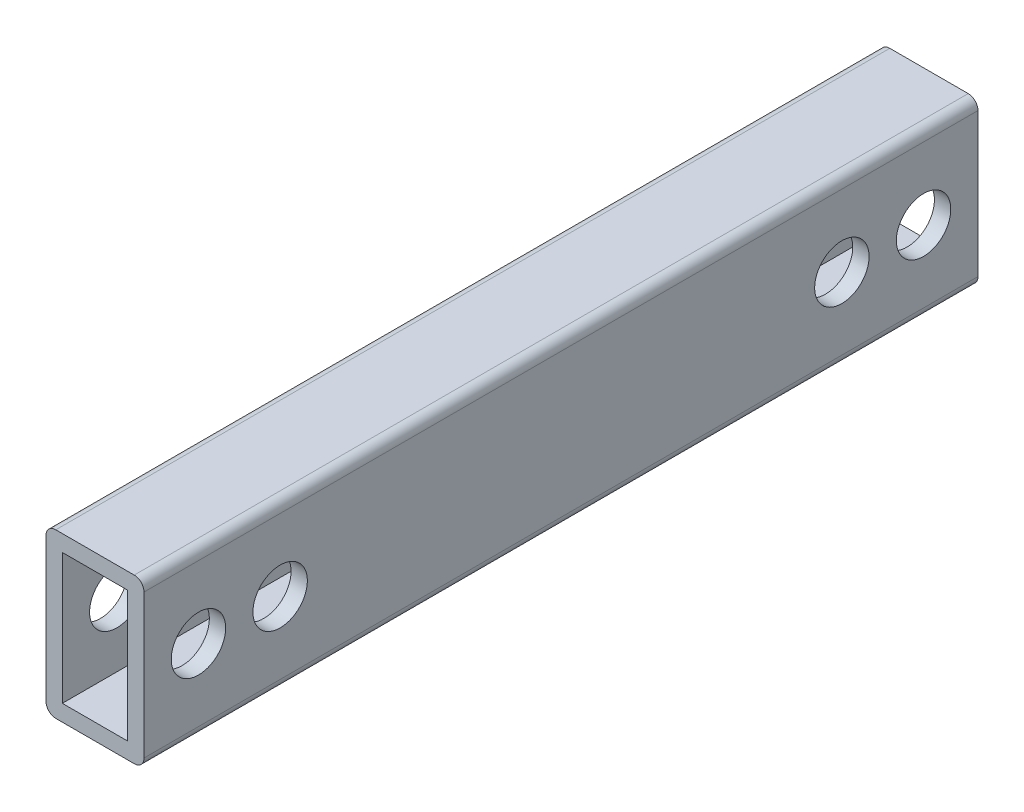
ISO-10303-21;
HEADER;
FILE_DESCRIPTION(('STEP AP214'),'2;1');
FILE_NAME('part.step','',(''),(''),'','','');
FILE_SCHEMA(('AUTOMOTIVE_DESIGN { 1 0 10303 214 1 1 1 1 }'));
ENDSEC;
DATA;
#1=APPLICATION_CONTEXT('core data for automotive mechanical design processes');
#2=APPLICATION_PROTOCOL_DEFINITION('international standard','automotive_design',2000,#1);
#3=PRODUCT_CONTEXT('',#1,'mechanical');
#4=PRODUCT('Part','Part','',(#3));
#5=PRODUCT_RELATED_PRODUCT_CATEGORY('part','',(#4));
#6=PRODUCT_DEFINITION_FORMATION('','',#4);
#7=PRODUCT_DEFINITION_CONTEXT('part definition',#1,'design');
#8=PRODUCT_DEFINITION('design','',#6,#7);
#9=PRODUCT_DEFINITION_SHAPE('','',#8);
#10=(LENGTH_UNIT() NAMED_UNIT(*) SI_UNIT(.MILLI.,.METRE.));
#11=(NAMED_UNIT(*) PLANE_ANGLE_UNIT() SI_UNIT($,.RADIAN.));
#12=(NAMED_UNIT(*) SI_UNIT($,.STERADIAN.) SOLID_ANGLE_UNIT());
#13=UNCERTAINTY_MEASURE_WITH_UNIT(LENGTH_MEASURE(1.E-05),#10,'distance_accuracy_value','');
#14=(GEOMETRIC_REPRESENTATION_CONTEXT(3) GLOBAL_UNCERTAINTY_ASSIGNED_CONTEXT((#13)) GLOBAL_UNIT_ASSIGNED_CONTEXT((#10,
#11,#12)) REPRESENTATION_CONTEXT('',''));
#15=CARTESIAN_POINT('',(0.,0.,0.));
#16=DIRECTION('',(0.,0.,1.));
#17=DIRECTION('',(1.,0.,0.));
#18=AXIS2_PLACEMENT_3D('',#15,#16,#17);
#19=CARTESIAN_POINT('',(0.,0.,153.15701543));
#20=DIRECTION('',(0.,0.,1.));
#21=DIRECTION('',(1.,0.,0.));
#22=AXIS2_PLACEMENT_3D('',#19,#20,#21);
#23=PLANE('',#22);
#24=DIRECTION('',(0.,-1.,0.));
#25=VECTOR('',#24,1.);
#26=CARTESIAN_POINT('',(-9.,-15.,153.15701543));
#27=LINE('',#26,#25);
#28=CARTESIAN_POINT('',(-9.,13.2,153.15701543));
#29=VERTEX_POINT('',#28);
#30=CARTESIAN_POINT('',(-9.,-13.2,153.15701543));
#31=VERTEX_POINT('',#30);
#32=EDGE_CURVE('E170',#29,#31,#27,.T.);
#33=ORIENTED_EDGE('',*,*,#32,.T.);
#34=CARTESIAN_POINT('',(-7.2,-13.2,153.15701543));
#35=DIRECTION('',(0.,0.,1.));
#36=DIRECTION('',(1.,0.,0.));
#37=AXIS2_PLACEMENT_3D('',#34,#35,#36);
#38=CIRCLE('',#37,1.8);
#39=CARTESIAN_POINT('',(-7.2,-15.,153.15701543));
#40=VERTEX_POINT('',#39);
#41=EDGE_CURVE('E229',#31,#40,#38,.T.);
#42=ORIENTED_EDGE('',*,*,#41,.T.);
#43=DIRECTION('',(1.,0.,0.));
#44=VECTOR('',#43,1.);
#45=CARTESIAN_POINT('',(9.,-15.,153.15701543));
#46=LINE('',#45,#44);
#47=CARTESIAN_POINT('',(7.2,-15.,153.15701543));
#48=VERTEX_POINT('',#47);
#49=EDGE_CURVE('E173',#40,#48,#46,.T.);
#50=ORIENTED_EDGE('',*,*,#49,.T.);
#51=CARTESIAN_POINT('',(7.2,-13.2,153.15701543));
#52=DIRECTION('',(0.,0.,1.));
#53=DIRECTION('',(1.,0.,0.));
#54=AXIS2_PLACEMENT_3D('',#51,#52,#53);
#55=CIRCLE('',#54,1.8);
#56=CARTESIAN_POINT('',(9.,-13.2,153.15701543));
#57=VERTEX_POINT('',#56);
#58=EDGE_CURVE('E227',#48,#57,#55,.T.);
#59=ORIENTED_EDGE('',*,*,#58,.T.);
#60=DIRECTION('',(0.,1.,0.));
#61=VECTOR('',#60,1.);
#62=CARTESIAN_POINT('',(9.,-15.,153.15701543));
#63=LINE('',#62,#61);
#64=CARTESIAN_POINT('',(9.,13.2,153.15701543));
#65=VERTEX_POINT('',#64);
#66=EDGE_CURVE('E177',#57,#65,#63,.T.);
#67=ORIENTED_EDGE('',*,*,#66,.T.);
#68=CARTESIAN_POINT('',(7.2,13.2,153.15701543));
#69=DIRECTION('',(0.,0.,1.));
#70=DIRECTION('',(1.,0.,0.));
#71=AXIS2_PLACEMENT_3D('',#68,#69,#70);
#72=CIRCLE('',#71,1.8);
#73=CARTESIAN_POINT('',(7.2,15.,153.15701543));
#74=VERTEX_POINT('',#73);
#75=EDGE_CURVE('E57',#65,#74,#72,.T.);
#76=ORIENTED_EDGE('',*,*,#75,.T.);
#77=DIRECTION('',(-1.,0.,0.));
#78=VECTOR('',#77,1.);
#79=CARTESIAN_POINT('',(9.,15.,153.15701543));
#80=LINE('',#79,#78);
#81=CARTESIAN_POINT('',(-7.2,15.,153.15701543));
#82=VERTEX_POINT('',#81);
#83=EDGE_CURVE('E179',#74,#82,#80,.T.);
#84=ORIENTED_EDGE('',*,*,#83,.T.);
#85=CARTESIAN_POINT('',(-7.2,13.2,153.15701543));
#86=DIRECTION('',(0.,0.,1.));
#87=DIRECTION('',(1.,0.,0.));
#88=AXIS2_PLACEMENT_3D('',#85,#86,#87);
#89=CIRCLE('',#88,1.8);
#90=EDGE_CURVE('E224',#82,#29,#89,.T.);
#91=ORIENTED_EDGE('',*,*,#90,.T.);
#92=EDGE_LOOP('',(#33,#42,#50,#59,#67,#76,#84,#91));
#93=FACE_BOUND('',#92,.T.);
#94=DIRECTION('',(1.,0.,0.));
#95=VECTOR('',#94,1.);
#96=CARTESIAN_POINT('',(6.,-12.,153.15701543));
#97=LINE('',#96,#95);
#98=CARTESIAN_POINT('',(-6.,-12.,153.15701543));
#99=VERTEX_POINT('',#98);
#100=CARTESIAN_POINT('',(6.,-12.,153.15701543));
#101=VERTEX_POINT('',#100);
#102=EDGE_CURVE('E137',#99,#101,#97,.T.);
#103=ORIENTED_EDGE('',*,*,#102,.F.);
#104=DIRECTION('',(0.,-1.,0.));
#105=VECTOR('',#104,1.);
#106=CARTESIAN_POINT('',(-6.,-12.,153.15701543));
#107=LINE('',#106,#105);
#108=CARTESIAN_POINT('',(-6.,12.,153.15701543));
#109=VERTEX_POINT('',#108);
#110=EDGE_CURVE('E127',#109,#99,#107,.T.);
#111=ORIENTED_EDGE('',*,*,#110,.F.);
#112=DIRECTION('',(-1.,0.,0.));
#113=VECTOR('',#112,1.);
#114=CARTESIAN_POINT('',(6.,12.,153.15701543));
#115=LINE('',#114,#113);
#116=CARTESIAN_POINT('',(6.,12.,153.15701543));
#117=VERTEX_POINT('',#116);
#118=EDGE_CURVE('E152',#117,#109,#115,.T.);
#119=ORIENTED_EDGE('',*,*,#118,.F.);
#120=DIRECTION('',(0.,1.,0.));
#121=VECTOR('',#120,1.);
#122=CARTESIAN_POINT('',(6.,-12.,153.15701543));
#123=LINE('',#122,#121);
#124=EDGE_CURVE('E150',#101,#117,#123,.T.);
#125=ORIENTED_EDGE('',*,*,#124,.F.);
#126=EDGE_LOOP('',(#103,#111,#119,#125));
#127=FACE_BOUND('',#126,.T.);
#128=ADVANCED_FACE('F36',(#93,#127),#23,.T.);
#129=CARTESIAN_POINT('',(0.,0.,0.));
#130=DIRECTION('',(0.,0.,1.));
#131=DIRECTION('',(1.,0.,0.));
#132=AXIS2_PLACEMENT_3D('',#129,#130,#131);
#133=PLANE('',#132);
#134=DIRECTION('',(1.,0.,0.));
#135=VECTOR('',#134,1.);
#136=CARTESIAN_POINT('',(9.,-15.,0.));
#137=LINE('',#136,#135);
#138=CARTESIAN_POINT('',(-7.2,-15.,0.));
#139=VERTEX_POINT('',#138);
#140=CARTESIAN_POINT('',(7.2,-15.,0.));
#141=VERTEX_POINT('',#140);
#142=EDGE_CURVE('E184',#139,#141,#137,.T.);
#143=ORIENTED_EDGE('',*,*,#142,.F.);
#144=CARTESIAN_POINT('',(-7.2,-13.2,0.));
#145=DIRECTION('',(0.,0.,1.));
#146=DIRECTION('',(1.,0.,0.));
#147=AXIS2_PLACEMENT_3D('',#144,#145,#146);
#148=CIRCLE('',#147,1.8);
#149=CARTESIAN_POINT('',(-9.,-13.2,0.));
#150=VERTEX_POINT('',#149);
#151=EDGE_CURVE('E217',#139,#150,#148,.F.);
#152=ORIENTED_EDGE('',*,*,#151,.T.);
#153=DIRECTION('',(0.,-1.,0.));
#154=VECTOR('',#153,1.);
#155=CARTESIAN_POINT('',(-9.,-15.,0.));
#156=LINE('',#155,#154);
#157=CARTESIAN_POINT('',(-9.,13.2,0.));
#158=VERTEX_POINT('',#157);
#159=EDGE_CURVE('E145',#158,#150,#156,.T.);
#160=ORIENTED_EDGE('',*,*,#159,.F.);
#161=CARTESIAN_POINT('',(-7.2,13.2,0.));
#162=DIRECTION('',(0.,0.,1.));
#163=DIRECTION('',(1.,0.,0.));
#164=AXIS2_PLACEMENT_3D('',#161,#162,#163);
#165=CIRCLE('',#164,1.8);
#166=CARTESIAN_POINT('',(-7.2,15.,0.));
#167=VERTEX_POINT('',#166);
#168=EDGE_CURVE('E211',#158,#167,#165,.F.);
#169=ORIENTED_EDGE('',*,*,#168,.T.);
#170=DIRECTION('',(-1.,0.,0.));
#171=VECTOR('',#170,1.);
#172=CARTESIAN_POINT('',(9.,15.,0.));
#173=LINE('',#172,#171);
#174=CARTESIAN_POINT('',(7.2,15.,0.));
#175=VERTEX_POINT('',#174);
#176=EDGE_CURVE('E174',#175,#167,#173,.T.);
#177=ORIENTED_EDGE('',*,*,#176,.F.);
#178=CARTESIAN_POINT('',(7.2,13.2,0.));
#179=DIRECTION('',(0.,0.,1.));
#180=DIRECTION('',(1.,0.,0.));
#181=AXIS2_PLACEMENT_3D('',#178,#179,#180);
#182=CIRCLE('',#181,1.8);
#183=CARTESIAN_POINT('',(9.,13.2,0.));
#184=VERTEX_POINT('',#183);
#185=EDGE_CURVE('E213',#175,#184,#182,.F.);
#186=ORIENTED_EDGE('',*,*,#185,.T.);
#187=DIRECTION('',(0.,1.,0.));
#188=VECTOR('',#187,1.);
#189=CARTESIAN_POINT('',(9.,-15.,0.));
#190=LINE('',#189,#188);
#191=CARTESIAN_POINT('',(9.,-13.2,0.));
#192=VERTEX_POINT('',#191);
#193=EDGE_CURVE('E187',#192,#184,#190,.T.);
#194=ORIENTED_EDGE('',*,*,#193,.F.);
#195=CARTESIAN_POINT('',(7.2,-13.2,0.));
#196=DIRECTION('',(0.,0.,1.));
#197=DIRECTION('',(1.,0.,0.));
#198=AXIS2_PLACEMENT_3D('',#195,#196,#197);
#199=CIRCLE('',#198,1.8);
#200=EDGE_CURVE('E215',#192,#141,#199,.F.);
#201=ORIENTED_EDGE('',*,*,#200,.T.);
#202=EDGE_LOOP('',(#143,#152,#160,#169,#177,#186,#194,#201));
#203=FACE_BOUND('',#202,.T.);
#204=DIRECTION('',(0.,-1.,0.));
#205=VECTOR('',#204,1.);
#206=CARTESIAN_POINT('',(-6.,-12.,0.));
#207=LINE('',#206,#205);
#208=CARTESIAN_POINT('',(-6.,12.,0.));
#209=VERTEX_POINT('',#208);
#210=CARTESIAN_POINT('',(-6.,-12.,0.));
#211=VERTEX_POINT('',#210);
#212=EDGE_CURVE('E157',#209,#211,#207,.T.);
#213=ORIENTED_EDGE('',*,*,#212,.T.);
#214=DIRECTION('',(1.,0.,0.));
#215=VECTOR('',#214,1.);
#216=CARTESIAN_POINT('',(6.,-12.,0.));
#217=LINE('',#216,#215);
#218=CARTESIAN_POINT('',(6.,-12.,0.));
#219=VERTEX_POINT('',#218);
#220=EDGE_CURVE('E144',#211,#219,#217,.T.);
#221=ORIENTED_EDGE('',*,*,#220,.T.);
#222=DIRECTION('',(0.,1.,0.));
#223=VECTOR('',#222,1.);
#224=CARTESIAN_POINT('',(6.,-12.,0.));
#225=LINE('',#224,#223);
#226=CARTESIAN_POINT('',(6.,12.,0.));
#227=VERTEX_POINT('',#226);
#228=EDGE_CURVE('E161',#219,#227,#225,.T.);
#229=ORIENTED_EDGE('',*,*,#228,.T.);
#230=DIRECTION('',(-1.,0.,0.));
#231=VECTOR('',#230,1.);
#232=CARTESIAN_POINT('',(6.,12.,0.));
#233=LINE('',#232,#231);
#234=EDGE_CURVE('E138',#227,#209,#233,.T.);
#235=ORIENTED_EDGE('',*,*,#234,.T.);
#236=EDGE_LOOP('',(#213,#221,#229,#235));
#237=FACE_BOUND('',#236,.T.);
#238=ADVANCED_FACE('F245',(#203,#237),#133,.F.);
#239=CARTESIAN_POINT('',(-9.,-15.,153.15701543));
#240=DIRECTION('',(1.,0.,0.));
#241=DIRECTION('',(0.,0.,-1.));
#242=AXIS2_PLACEMENT_3D('',#239,#240,#241);
#243=PLANE('',#242);
#244=CARTESIAN_POINT('',(-9.,0.,143.15701543));
#245=DIRECTION('',(1.,0.,0.));
#246=DIRECTION('',(0.,0.,-1.));
#247=AXIS2_PLACEMENT_3D('',#244,#245,#246);
#248=CIRCLE('',#247,4.99999999999999);
#249=CARTESIAN_POINT('',(-9.,0.,138.15701543));
#250=VERTEX_POINT('',#249);
#251=EDGE_CURVE('E195',#250,#250,#248,.T.);
#252=ORIENTED_EDGE('',*,*,#251,.T.);
#253=EDGE_LOOP('',(#252));
#254=FACE_BOUND('',#253,.T.);
#255=CARTESIAN_POINT('',(-9.,0.,128.15701543));
#256=DIRECTION('',(1.,0.,0.));
#257=DIRECTION('',(0.,0.,-1.));
#258=AXIS2_PLACEMENT_3D('',#255,#256,#257);
#259=CIRCLE('',#258,4.99999999999999);
#260=CARTESIAN_POINT('',(-9.,0.,123.15701543));
#261=VERTEX_POINT('',#260);
#262=EDGE_CURVE('E303',#261,#261,#259,.T.);
#263=ORIENTED_EDGE('',*,*,#262,.T.);
#264=EDGE_LOOP('',(#263));
#265=FACE_BOUND('',#264,.T.);
#266=CARTESIAN_POINT('',(-9.,0.,25.));
#267=DIRECTION('',(1.,0.,0.));
#268=DIRECTION('',(0.,0.,1.));
#269=AXIS2_PLACEMENT_3D('',#266,#267,#268);
#270=CIRCLE('',#269,4.99999999999999);
#271=CARTESIAN_POINT('',(-9.,0.,30.));
#272=VERTEX_POINT('',#271);
#273=EDGE_CURVE('E307',#272,#272,#270,.T.);
#274=ORIENTED_EDGE('',*,*,#273,.T.);
#275=EDGE_LOOP('',(#274));
#276=FACE_BOUND('',#275,.T.);
#277=CARTESIAN_POINT('',(-9.,0.,10.));
#278=DIRECTION('',(1.,0.,0.));
#279=DIRECTION('',(0.,0.,1.));
#280=AXIS2_PLACEMENT_3D('',#277,#278,#279);
#281=CIRCLE('',#280,4.99999999999999);
#282=CARTESIAN_POINT('',(-9.,0.,15.));
#283=VERTEX_POINT('',#282);
#284=EDGE_CURVE('E310',#283,#283,#281,.T.);
#285=ORIENTED_EDGE('',*,*,#284,.T.);
#286=EDGE_LOOP('',(#285));
#287=FACE_BOUND('',#286,.T.);
#288=ORIENTED_EDGE('',*,*,#159,.T.);
#289=DIRECTION('',(0.,0.,-1.));
#290=VECTOR('',#289,1.);
#291=CARTESIAN_POINT('',(-9.,-13.2,153.15701543));
#292=LINE('',#291,#290);
#293=EDGE_CURVE('E222',#150,#31,#292,.F.);
#294=ORIENTED_EDGE('',*,*,#293,.T.);
#295=ORIENTED_EDGE('',*,*,#32,.F.);
#296=DIRECTION('',(0.,0.,-1.));
#297=VECTOR('',#296,1.);
#298=CARTESIAN_POINT('',(-9.,13.2,153.15701543));
#299=LINE('',#298,#297);
#300=EDGE_CURVE('E219',#29,#158,#299,.T.);
#301=ORIENTED_EDGE('',*,*,#300,.T.);
#302=EDGE_LOOP('',(#288,#294,#295,#301));
#303=FACE_BOUND('',#302,.T.);
#304=ADVANCED_FACE('F258',(#254,#265,#276,#287,#303),#243,.F.);
#305=CARTESIAN_POINT('',(9.,-15.,153.15701543));
#306=DIRECTION('',(0.,1.,0.));
#307=DIRECTION('',(0.,0.,1.));
#308=AXIS2_PLACEMENT_3D('',#305,#306,#307);
#309=PLANE('',#308);
#310=ORIENTED_EDGE('',*,*,#49,.F.);
#311=DIRECTION('',(0.,0.,-1.));
#312=VECTOR('',#311,1.);
#313=CARTESIAN_POINT('',(-7.2,-15.,153.15701543));
#314=LINE('',#313,#312);
#315=EDGE_CURVE('E208',#40,#139,#314,.T.);
#316=ORIENTED_EDGE('',*,*,#315,.T.);
#317=ORIENTED_EDGE('',*,*,#142,.T.);
#318=DIRECTION('',(0.,0.,-1.));
#319=VECTOR('',#318,1.);
#320=CARTESIAN_POINT('',(7.2,-15.,153.15701543));
#321=LINE('',#320,#319);
#322=EDGE_CURVE('E181',#141,#48,#321,.F.);
#323=ORIENTED_EDGE('',*,*,#322,.T.);
#324=EDGE_LOOP('',(#310,#316,#317,#323));
#325=FACE_BOUND('',#324,.T.);
#326=ADVANCED_FACE('F266',(#325),#309,.F.);
#327=CARTESIAN_POINT('',(9.,-15.,153.15701543));
#328=DIRECTION('',(-1.,0.,0.));
#329=DIRECTION('',(0.,0.,1.));
#330=AXIS2_PLACEMENT_3D('',#327,#328,#329);
#331=PLANE('',#330);
#332=CARTESIAN_POINT('',(9.,0.,143.15701543));
#333=DIRECTION('',(1.,0.,0.));
#334=DIRECTION('',(0.,0.,-1.));
#335=AXIS2_PLACEMENT_3D('',#332,#333,#334);
#336=CIRCLE('',#335,4.99999999999999);
#337=CARTESIAN_POINT('',(9.,0.,138.15701543));
#338=VERTEX_POINT('',#337);
#339=EDGE_CURVE('E394',#338,#338,#336,.T.);
#340=ORIENTED_EDGE('',*,*,#339,.F.);
#341=EDGE_LOOP('',(#340));
#342=FACE_BOUND('',#341,.T.);
#343=CARTESIAN_POINT('',(9.,0.,128.15701543));
#344=DIRECTION('',(1.,0.,0.));
#345=DIRECTION('',(0.,0.,-1.));
#346=AXIS2_PLACEMENT_3D('',#343,#344,#345);
#347=CIRCLE('',#346,4.99999999999999);
#348=CARTESIAN_POINT('',(9.,0.,123.15701543));
#349=VERTEX_POINT('',#348);
#350=EDGE_CURVE('E389',#349,#349,#347,.T.);
#351=ORIENTED_EDGE('',*,*,#350,.F.);
#352=EDGE_LOOP('',(#351));
#353=FACE_BOUND('',#352,.T.);
#354=CARTESIAN_POINT('',(9.,0.,25.));
#355=DIRECTION('',(1.,0.,0.));
#356=DIRECTION('',(0.,0.,1.));
#357=AXIS2_PLACEMENT_3D('',#354,#355,#356);
#358=CIRCLE('',#357,4.99999999999999);
#359=CARTESIAN_POINT('',(9.,0.,30.));
#360=VERTEX_POINT('',#359);
#361=EDGE_CURVE('E386',#360,#360,#358,.T.);
#362=ORIENTED_EDGE('',*,*,#361,.F.);
#363=EDGE_LOOP('',(#362));
#364=FACE_BOUND('',#363,.T.);
#365=CARTESIAN_POINT('',(9.,0.,10.));
#366=DIRECTION('',(1.,0.,0.));
#367=DIRECTION('',(0.,0.,1.));
#368=AXIS2_PLACEMENT_3D('',#365,#366,#367);
#369=CIRCLE('',#368,4.99999999999999);
#370=CARTESIAN_POINT('',(9.,0.,15.));
#371=VERTEX_POINT('',#370);
#372=EDGE_CURVE('E312',#371,#371,#369,.T.);
#373=ORIENTED_EDGE('',*,*,#372,.F.);
#374=EDGE_LOOP('',(#373));
#375=FACE_BOUND('',#374,.T.);
#376=ORIENTED_EDGE('',*,*,#66,.F.);
#377=DIRECTION('',(0.,0.,-1.));
#378=VECTOR('',#377,1.);
#379=CARTESIAN_POINT('',(9.,-13.2,153.15701543));
#380=LINE('',#379,#378);
#381=EDGE_CURVE('E233',#57,#192,#380,.T.);
#382=ORIENTED_EDGE('',*,*,#381,.T.);
#383=ORIENTED_EDGE('',*,*,#193,.T.);
#384=DIRECTION('',(0.,0.,-1.));
#385=VECTOR('',#384,1.);
#386=CARTESIAN_POINT('',(9.,13.2,153.15701543));
#387=LINE('',#386,#385);
#388=EDGE_CURVE('E231',#184,#65,#387,.F.);
#389=ORIENTED_EDGE('',*,*,#388,.T.);
#390=EDGE_LOOP('',(#376,#382,#383,#389));
#391=FACE_BOUND('',#390,.T.);
#392=ADVANCED_FACE('F239',(#342,#353,#364,#375,#391),#331,.F.);
#393=CARTESIAN_POINT('',(9.,15.,153.15701543));
#394=DIRECTION('',(0.,-1.,0.));
#395=DIRECTION('',(0.,0.,-1.));
#396=AXIS2_PLACEMENT_3D('',#393,#394,#395);
#397=PLANE('',#396);
#398=ORIENTED_EDGE('',*,*,#83,.F.);
#399=DIRECTION('',(0.,0.,-1.));
#400=VECTOR('',#399,1.);
#401=CARTESIAN_POINT('',(7.2,15.,153.15701543));
#402=LINE('',#401,#400);
#403=EDGE_CURVE('E11',#74,#175,#402,.T.);
#404=ORIENTED_EDGE('',*,*,#403,.T.);
#405=ORIENTED_EDGE('',*,*,#176,.T.);
#406=DIRECTION('',(0.,0.,-1.));
#407=VECTOR('',#406,1.);
#408=CARTESIAN_POINT('',(-7.2,15.,153.15701543));
#409=LINE('',#408,#407);
#410=EDGE_CURVE('E44',#167,#82,#409,.F.);
#411=ORIENTED_EDGE('',*,*,#410,.T.);
#412=EDGE_LOOP('',(#398,#404,#405,#411));
#413=FACE_BOUND('',#412,.T.);
#414=ADVANCED_FACE('F251',(#413),#397,.F.);
#415=CARTESIAN_POINT('',(-6.,-12.,153.15701543));
#416=DIRECTION('',(1.,0.,0.));
#417=DIRECTION('',(0.,0.,-1.));
#418=AXIS2_PLACEMENT_3D('',#415,#416,#417);
#419=PLANE('',#418);
#420=CARTESIAN_POINT('',(-6.,0.,143.15701543));
#421=DIRECTION('',(1.,0.,0.));
#422=DIRECTION('',(0.,0.,-1.));
#423=AXIS2_PLACEMENT_3D('',#420,#421,#422);
#424=CIRCLE('',#423,4.99999999999999);
#425=CARTESIAN_POINT('',(-6.,0.,138.15701543));
#426=VERTEX_POINT('',#425);
#427=EDGE_CURVE('E159',#426,#426,#424,.T.);
#428=ORIENTED_EDGE('',*,*,#427,.F.);
#429=EDGE_LOOP('',(#428));
#430=FACE_BOUND('',#429,.T.);
#431=CARTESIAN_POINT('',(-6.,0.,128.15701543));
#432=DIRECTION('',(1.,0.,0.));
#433=DIRECTION('',(0.,0.,-1.));
#434=AXIS2_PLACEMENT_3D('',#431,#432,#433);
#435=CIRCLE('',#434,4.99999999999999);
#436=CARTESIAN_POINT('',(-6.,0.,123.15701543));
#437=VERTEX_POINT('',#436);
#438=EDGE_CURVE('E203',#437,#437,#435,.T.);
#439=ORIENTED_EDGE('',*,*,#438,.F.);
#440=EDGE_LOOP('',(#439));
#441=FACE_BOUND('',#440,.T.);
#442=CARTESIAN_POINT('',(-6.,0.,25.));
#443=DIRECTION('',(1.,0.,0.));
#444=DIRECTION('',(0.,0.,-1.));
#445=AXIS2_PLACEMENT_3D('',#442,#443,#444);
#446=CIRCLE('',#445,4.99999999999999);
#447=CARTESIAN_POINT('',(-6.,0.,20.));
#448=VERTEX_POINT('',#447);
#449=EDGE_CURVE('E199',#448,#448,#446,.T.);
#450=ORIENTED_EDGE('',*,*,#449,.F.);
#451=EDGE_LOOP('',(#450));
#452=FACE_BOUND('',#451,.T.);
#453=CARTESIAN_POINT('',(-6.,0.,10.));
#454=DIRECTION('',(1.,0.,0.));
#455=DIRECTION('',(0.,0.,-1.));
#456=AXIS2_PLACEMENT_3D('',#453,#454,#455);
#457=CIRCLE('',#456,4.99999999999999);
#458=CARTESIAN_POINT('',(-6.,0.,5.00000000000002));
#459=VERTEX_POINT('',#458);
#460=EDGE_CURVE('E194',#459,#459,#457,.T.);
#461=ORIENTED_EDGE('',*,*,#460,.F.);
#462=EDGE_LOOP('',(#461));
#463=FACE_BOUND('',#462,.T.);
#464=ORIENTED_EDGE('',*,*,#212,.F.);
#465=DIRECTION('',(0.,0.,-1.));
#466=VECTOR('',#465,1.);
#467=CARTESIAN_POINT('',(-6.,12.,153.15701543));
#468=LINE('',#467,#466);
#469=EDGE_CURVE('E133',#109,#209,#468,.T.);
#470=ORIENTED_EDGE('',*,*,#469,.F.);
#471=ORIENTED_EDGE('',*,*,#110,.T.);
#472=DIRECTION('',(0.,0.,-1.));
#473=VECTOR('',#472,1.);
#474=CARTESIAN_POINT('',(-6.,-12.,153.15701543));
#475=LINE('',#474,#473);
#476=EDGE_CURVE('E130',#99,#211,#475,.T.);
#477=ORIENTED_EDGE('',*,*,#476,.T.);
#478=EDGE_LOOP('',(#464,#470,#471,#477));
#479=FACE_BOUND('',#478,.T.);
#480=ADVANCED_FACE('F129',(#430,#441,#452,#463,#479),#419,.T.);
#481=CARTESIAN_POINT('',(6.,-12.,153.15701543));
#482=DIRECTION('',(0.,1.,0.));
#483=DIRECTION('',(0.,0.,1.));
#484=AXIS2_PLACEMENT_3D('',#481,#482,#483);
#485=PLANE('',#484);
#486=ORIENTED_EDGE('',*,*,#220,.F.);
#487=ORIENTED_EDGE('',*,*,#476,.F.);
#488=ORIENTED_EDGE('',*,*,#102,.T.);
#489=DIRECTION('',(0.,0.,-1.));
#490=VECTOR('',#489,1.);
#491=CARTESIAN_POINT('',(6.,-12.,153.15701543));
#492=LINE('',#491,#490);
#493=EDGE_CURVE('E146',#101,#219,#492,.T.);
#494=ORIENTED_EDGE('',*,*,#493,.T.);
#495=EDGE_LOOP('',(#486,#487,#488,#494));
#496=FACE_BOUND('',#495,.T.);
#497=ADVANCED_FACE('F141',(#496),#485,.T.);
#498=CARTESIAN_POINT('',(6.,-12.,153.15701543));
#499=DIRECTION('',(-1.,0.,0.));
#500=DIRECTION('',(0.,0.,1.));
#501=AXIS2_PLACEMENT_3D('',#498,#499,#500);
#502=PLANE('',#501);
#503=CARTESIAN_POINT('',(6.,0.,143.15701543));
#504=DIRECTION('',(-1.,0.,0.));
#505=DIRECTION('',(0.,0.,1.));
#506=AXIS2_PLACEMENT_3D('',#503,#504,#505);
#507=CIRCLE('',#506,4.99999999999999);
#508=CARTESIAN_POINT('',(6.,0.,148.15701543));
#509=VERTEX_POINT('',#508);
#510=EDGE_CURVE('E204',#509,#509,#507,.T.);
#511=ORIENTED_EDGE('',*,*,#510,.F.);
#512=EDGE_LOOP('',(#511));
#513=FACE_BOUND('',#512,.T.);
#514=CARTESIAN_POINT('',(6.,0.,128.15701543));
#515=DIRECTION('',(-1.,0.,0.));
#516=DIRECTION('',(0.,0.,1.));
#517=AXIS2_PLACEMENT_3D('',#514,#515,#516);
#518=CIRCLE('',#517,4.99999999999999);
#519=CARTESIAN_POINT('',(6.,0.,133.15701543));
#520=VERTEX_POINT('',#519);
#521=EDGE_CURVE('E200',#520,#520,#518,.T.);
#522=ORIENTED_EDGE('',*,*,#521,.F.);
#523=EDGE_LOOP('',(#522));
#524=FACE_BOUND('',#523,.T.);
#525=CARTESIAN_POINT('',(6.,0.,25.));
#526=DIRECTION('',(-1.,0.,0.));
#527=DIRECTION('',(0.,0.,1.));
#528=AXIS2_PLACEMENT_3D('',#525,#526,#527);
#529=CIRCLE('',#528,4.99999999999999);
#530=CARTESIAN_POINT('',(6.,0.,30.));
#531=VERTEX_POINT('',#530);
#532=EDGE_CURVE('E196',#531,#531,#529,.T.);
#533=ORIENTED_EDGE('',*,*,#532,.F.);
#534=EDGE_LOOP('',(#533));
#535=FACE_BOUND('',#534,.T.);
#536=CARTESIAN_POINT('',(6.,0.,10.));
#537=DIRECTION('',(-1.,0.,0.));
#538=DIRECTION('',(0.,0.,1.));
#539=AXIS2_PLACEMENT_3D('',#536,#537,#538);
#540=CIRCLE('',#539,4.99999999999999);
#541=CARTESIAN_POINT('',(6.,0.,15.));
#542=VERTEX_POINT('',#541);
#543=EDGE_CURVE('E191',#542,#542,#540,.T.);
#544=ORIENTED_EDGE('',*,*,#543,.F.);
#545=EDGE_LOOP('',(#544));
#546=FACE_BOUND('',#545,.T.);
#547=ORIENTED_EDGE('',*,*,#228,.F.);
#548=ORIENTED_EDGE('',*,*,#493,.F.);
#549=ORIENTED_EDGE('',*,*,#124,.T.);
#550=DIRECTION('',(0.,0.,-1.));
#551=VECTOR('',#550,1.);
#552=CARTESIAN_POINT('',(6.,12.,153.15701543));
#553=LINE('',#552,#551);
#554=EDGE_CURVE('E167',#117,#227,#553,.T.);
#555=ORIENTED_EDGE('',*,*,#554,.T.);
#556=EDGE_LOOP('',(#547,#548,#549,#555));
#557=FACE_BOUND('',#556,.T.);
#558=ADVANCED_FACE('F362',(#513,#524,#535,#546,#557),#502,.T.);
#559=CARTESIAN_POINT('',(6.,12.,153.15701543));
#560=DIRECTION('',(0.,-1.,0.));
#561=DIRECTION('',(0.,0.,-1.));
#562=AXIS2_PLACEMENT_3D('',#559,#560,#561);
#563=PLANE('',#562);
#564=ORIENTED_EDGE('',*,*,#234,.F.);
#565=ORIENTED_EDGE('',*,*,#554,.F.);
#566=ORIENTED_EDGE('',*,*,#118,.T.);
#567=ORIENTED_EDGE('',*,*,#469,.T.);
#568=EDGE_LOOP('',(#564,#565,#566,#567));
#569=FACE_BOUND('',#568,.T.);
#570=ADVANCED_FACE('F355',(#569),#563,.T.);
#571=CARTESIAN_POINT('',(-9.,0.,10.));
#572=DIRECTION('',(1.,0.,0.));
#573=DIRECTION('',(0.,0.,-1.));
#574=AXIS2_PLACEMENT_3D('',#571,#572,#573);
#575=CYLINDRICAL_SURFACE('',#574,4.99999999999999);
#576=ORIENTED_EDGE('',*,*,#543,.T.);
#577=EDGE_LOOP('',(#576));
#578=FACE_BOUND('',#577,.T.);
#579=ORIENTED_EDGE('',*,*,#372,.T.);
#580=EDGE_LOOP('',(#579));
#581=FACE_BOUND('',#580,.T.);
#582=ADVANCED_FACE('F341',(#578,#581),#575,.F.);
#583=CARTESIAN_POINT('',(-9.,0.,25.));
#584=DIRECTION('',(1.,0.,0.));
#585=DIRECTION('',(0.,0.,-1.));
#586=AXIS2_PLACEMENT_3D('',#583,#584,#585);
#587=CYLINDRICAL_SURFACE('',#586,4.99999999999999);
#588=ORIENTED_EDGE('',*,*,#532,.T.);
#589=EDGE_LOOP('',(#588));
#590=FACE_BOUND('',#589,.T.);
#591=ORIENTED_EDGE('',*,*,#361,.T.);
#592=EDGE_LOOP('',(#591));
#593=FACE_BOUND('',#592,.T.);
#594=ADVANCED_FACE('F349',(#590,#593),#587,.F.);
#595=CARTESIAN_POINT('',(-9.,0.,128.15701543));
#596=DIRECTION('',(1.,0.,0.));
#597=DIRECTION('',(0.,0.,-1.));
#598=AXIS2_PLACEMENT_3D('',#595,#596,#597);
#599=CYLINDRICAL_SURFACE('',#598,4.99999999999999);
#600=ORIENTED_EDGE('',*,*,#521,.T.);
#601=EDGE_LOOP('',(#600));
#602=FACE_BOUND('',#601,.T.);
#603=ORIENTED_EDGE('',*,*,#350,.T.);
#604=EDGE_LOOP('',(#603));
#605=FACE_BOUND('',#604,.T.);
#606=ADVANCED_FACE('F350',(#602,#605),#599,.F.);
#607=CARTESIAN_POINT('',(-9.,0.,143.15701543));
#608=DIRECTION('',(1.,0.,0.));
#609=DIRECTION('',(0.,0.,-1.));
#610=AXIS2_PLACEMENT_3D('',#607,#608,#609);
#611=CYLINDRICAL_SURFACE('',#610,4.99999999999999);
#612=ORIENTED_EDGE('',*,*,#510,.T.);
#613=EDGE_LOOP('',(#612));
#614=FACE_BOUND('',#613,.T.);
#615=ORIENTED_EDGE('',*,*,#339,.T.);
#616=EDGE_LOOP('',(#615));
#617=FACE_BOUND('',#616,.T.);
#618=ADVANCED_FACE('F339',(#614,#617),#611,.F.);
#619=ORIENTED_EDGE('',*,*,#460,.T.);
#620=EDGE_LOOP('',(#619));
#621=FACE_BOUND('',#620,.T.);
#622=ORIENTED_EDGE('',*,*,#284,.F.);
#623=EDGE_LOOP('',(#622));
#624=FACE_BOUND('',#623,.T.);
#625=ADVANCED_FACE('F336',(#621,#624),#575,.F.);
#626=ORIENTED_EDGE('',*,*,#449,.T.);
#627=EDGE_LOOP('',(#626));
#628=FACE_BOUND('',#627,.T.);
#629=ORIENTED_EDGE('',*,*,#273,.F.);
#630=EDGE_LOOP('',(#629));
#631=FACE_BOUND('',#630,.T.);
#632=ADVANCED_FACE('F338',(#628,#631),#587,.F.);
#633=ORIENTED_EDGE('',*,*,#438,.T.);
#634=EDGE_LOOP('',(#633));
#635=FACE_BOUND('',#634,.T.);
#636=ORIENTED_EDGE('',*,*,#262,.F.);
#637=EDGE_LOOP('',(#636));
#638=FACE_BOUND('',#637,.T.);
#639=ADVANCED_FACE('F346',(#635,#638),#599,.F.);
#640=ORIENTED_EDGE('',*,*,#427,.T.);
#641=EDGE_LOOP('',(#640));
#642=FACE_BOUND('',#641,.T.);
#643=ORIENTED_EDGE('',*,*,#251,.F.);
#644=EDGE_LOOP('',(#643));
#645=FACE_BOUND('',#644,.T.);
#646=ADVANCED_FACE('F275',(#642,#645),#611,.F.);
#647=CARTESIAN_POINT('',(-7.2,-13.2,153.15701543));
#648=DIRECTION('',(0.,0.,-1.));
#649=DIRECTION('',(-1.,0.,0.));
#650=AXIS2_PLACEMENT_3D('',#647,#648,#649);
#651=CYLINDRICAL_SURFACE('',#650,1.8);
#652=ORIENTED_EDGE('',*,*,#41,.F.);
#653=ORIENTED_EDGE('',*,*,#293,.F.);
#654=ORIENTED_EDGE('',*,*,#151,.F.);
#655=ORIENTED_EDGE('',*,*,#315,.F.);
#656=EDGE_LOOP('',(#652,#653,#654,#655));
#657=FACE_BOUND('',#656,.T.);
#658=ADVANCED_FACE('F263',(#657),#651,.T.);
#659=CARTESIAN_POINT('',(7.2,-13.2,153.15701543));
#660=DIRECTION('',(0.,0.,-1.));
#661=DIRECTION('',(-1.,0.,0.));
#662=AXIS2_PLACEMENT_3D('',#659,#660,#661);
#663=CYLINDRICAL_SURFACE('',#662,1.8);
#664=ORIENTED_EDGE('',*,*,#58,.F.);
#665=ORIENTED_EDGE('',*,*,#322,.F.);
#666=ORIENTED_EDGE('',*,*,#200,.F.);
#667=ORIENTED_EDGE('',*,*,#381,.F.);
#668=EDGE_LOOP('',(#664,#665,#666,#667));
#669=FACE_BOUND('',#668,.T.);
#670=ADVANCED_FACE('F268',(#669),#663,.T.);
#671=CARTESIAN_POINT('',(7.2,13.2,153.15701543));
#672=DIRECTION('',(0.,0.,-1.));
#673=DIRECTION('',(-1.,0.,0.));
#674=AXIS2_PLACEMENT_3D('',#671,#672,#673);
#675=CYLINDRICAL_SURFACE('',#674,1.8);
#676=ORIENTED_EDGE('',*,*,#75,.F.);
#677=ORIENTED_EDGE('',*,*,#388,.F.);
#678=ORIENTED_EDGE('',*,*,#185,.F.);
#679=ORIENTED_EDGE('',*,*,#403,.F.);
#680=EDGE_LOOP('',(#676,#677,#678,#679));
#681=FACE_BOUND('',#680,.T.);
#682=ADVANCED_FACE('F250',(#681),#675,.T.);
#683=CARTESIAN_POINT('',(-7.2,13.2,153.15701543));
#684=DIRECTION('',(0.,0.,-1.));
#685=DIRECTION('',(-1.,0.,0.));
#686=AXIS2_PLACEMENT_3D('',#683,#684,#685);
#687=CYLINDRICAL_SURFACE('',#686,1.8);
#688=ORIENTED_EDGE('',*,*,#90,.F.);
#689=ORIENTED_EDGE('',*,*,#410,.F.);
#690=ORIENTED_EDGE('',*,*,#168,.F.);
#691=ORIENTED_EDGE('',*,*,#300,.F.);
#692=EDGE_LOOP('',(#688,#689,#690,#691));
#693=FACE_BOUND('',#692,.T.);
#694=ADVANCED_FACE('F38',(#693),#687,.T.);
#695=CLOSED_SHELL('',(#128,#238,#304,#326,#392,#414,#480,#497,#558,#570,#582,#594,#606,#618,
#625,#632,#639,#646,#658,#670,#682,#694));
#696=MANIFOLD_SOLID_BREP('B2',#695);
#697=ADVANCED_BREP_SHAPE_REPRESENTATION('',(#18,#696),#14);
#698=SHAPE_DEFINITION_REPRESENTATION(#9,#697);
ENDSEC;
END-ISO-10303-21;
